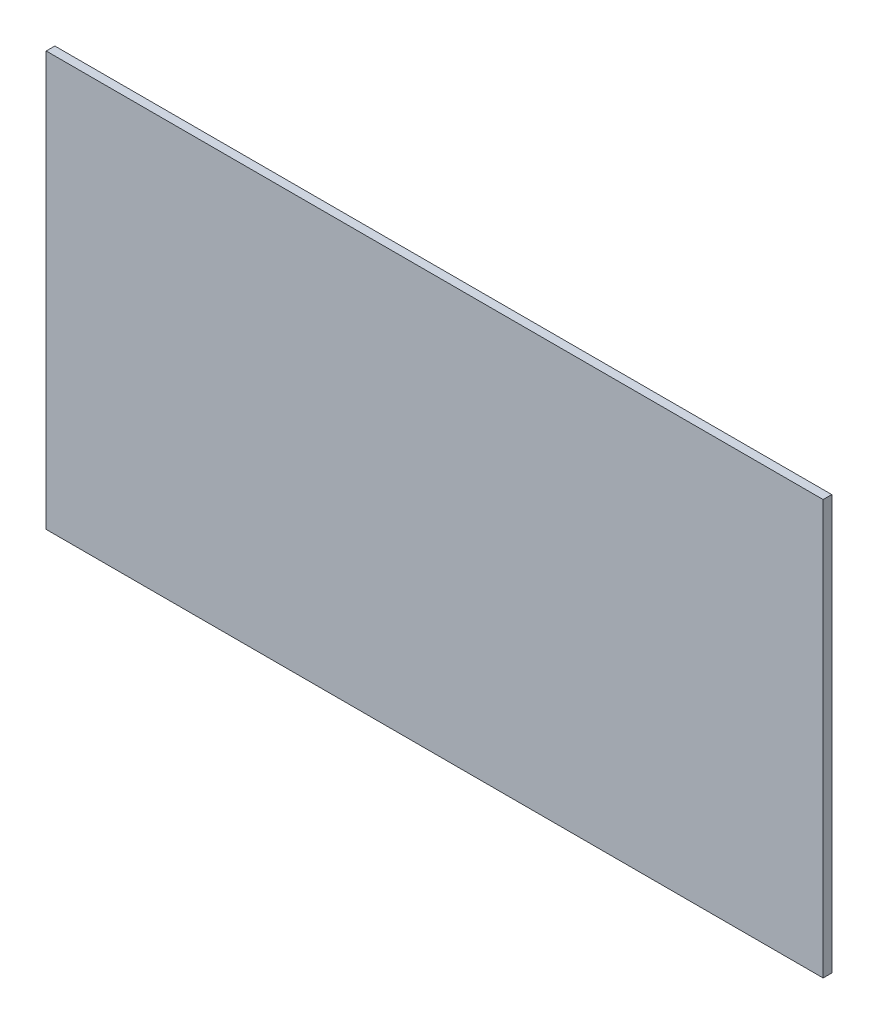
ISO-10303-21;
HEADER;
FILE_DESCRIPTION(('STEP AP214'),'2;1');
FILE_NAME('part.step','',(''),(''),'','','');
FILE_SCHEMA(('AUTOMOTIVE_DESIGN { 1 0 10303 214 1 1 1 1 }'));
ENDSEC;
DATA;
#1=APPLICATION_CONTEXT('core data for automotive mechanical design processes');
#2=APPLICATION_PROTOCOL_DEFINITION('international standard','automotive_design',2000,#1);
#3=PRODUCT_CONTEXT('',#1,'mechanical');
#4=PRODUCT('Part','Part','',(#3));
#5=PRODUCT_RELATED_PRODUCT_CATEGORY('part','',(#4));
#6=PRODUCT_DEFINITION_FORMATION('','',#4);
#7=PRODUCT_DEFINITION_CONTEXT('part definition',#1,'design');
#8=PRODUCT_DEFINITION('design','',#6,#7);
#9=PRODUCT_DEFINITION_SHAPE('','',#8);
#10=(LENGTH_UNIT() NAMED_UNIT(*) SI_UNIT(.MILLI.,.METRE.));
#11=(NAMED_UNIT(*) PLANE_ANGLE_UNIT() SI_UNIT($,.RADIAN.));
#12=(NAMED_UNIT(*) SI_UNIT($,.STERADIAN.) SOLID_ANGLE_UNIT());
#13=UNCERTAINTY_MEASURE_WITH_UNIT(LENGTH_MEASURE(1.E-05),#10,'distance_accuracy_value','');
#14=(GEOMETRIC_REPRESENTATION_CONTEXT(3) GLOBAL_UNCERTAINTY_ASSIGNED_CONTEXT((#13)) GLOBAL_UNIT_ASSIGNED_CONTEXT((#10,
#11,#12)) REPRESENTATION_CONTEXT('',''));
#15=CARTESIAN_POINT('',(0.,0.,0.));
#16=DIRECTION('',(0.,0.,1.));
#17=DIRECTION('',(1.,0.,0.));
#18=AXIS2_PLACEMENT_3D('',#15,#16,#17);
#19=CARTESIAN_POINT('',(-571.5,-723.9,12.7));
#20=DIRECTION('',(1.,0.,0.));
#21=DIRECTION('',(0.,1.,0.));
#22=AXIS2_PLACEMENT_3D('',#19,#20,#21);
#23=PLANE('',#22);
#24=DIRECTION('',(0.,-1.,0.));
#25=VECTOR('',#24,1.);
#26=CARTESIAN_POINT('',(-571.5,-723.9,0.));
#27=LINE('',#26,#25);
#28=CARTESIAN_POINT('',(-571.5,-114.3,0.));
#29=VERTEX_POINT('',#28);
#30=CARTESIAN_POINT('',(-571.5,-723.9,0.));
#31=VERTEX_POINT('',#30);
#32=EDGE_CURVE('E96',#29,#31,#27,.T.);
#33=ORIENTED_EDGE('',*,*,#32,.T.);
#34=DIRECTION('',(0.,0.,-1.));
#35=VECTOR('',#34,1.);
#36=CARTESIAN_POINT('',(-571.5,-723.9,12.7));
#37=LINE('',#36,#35);
#38=CARTESIAN_POINT('',(-571.5,-723.9,12.7));
#39=VERTEX_POINT('',#38);
#40=EDGE_CURVE('E11',#39,#31,#37,.T.);
#41=ORIENTED_EDGE('',*,*,#40,.F.);
#42=DIRECTION('',(0.,-1.,0.));
#43=VECTOR('',#42,1.);
#44=CARTESIAN_POINT('',(-571.5,-723.9,12.7));
#45=LINE('',#44,#43);
#46=CARTESIAN_POINT('',(-571.5,-114.3,12.7));
#47=VERTEX_POINT('',#46);
#48=EDGE_CURVE('E84',#47,#39,#45,.T.);
#49=ORIENTED_EDGE('',*,*,#48,.F.);
#50=DIRECTION('',(0.,0.,-1.));
#51=VECTOR('',#50,1.);
#52=CARTESIAN_POINT('',(-571.5,-114.3,12.7));
#53=LINE('',#52,#51);
#54=EDGE_CURVE('E92',#47,#29,#53,.T.);
#55=ORIENTED_EDGE('',*,*,#54,.T.);
#56=EDGE_LOOP('',(#33,#41,#49,#55));
#57=FACE_BOUND('',#56,.T.);
#58=ADVANCED_FACE('F33',(#57),#23,.F.);
#59=CARTESIAN_POINT('',(-571.5,-723.9,12.7));
#60=DIRECTION('',(0.,1.,0.));
#61=DIRECTION('',(-1.,0.,0.));
#62=AXIS2_PLACEMENT_3D('',#59,#60,#61);
#63=PLANE('',#62);
#64=DIRECTION('',(1.,0.,0.));
#65=VECTOR('',#64,1.);
#66=CARTESIAN_POINT('',(-571.5,-723.9,0.));
#67=LINE('',#66,#65);
#68=CARTESIAN_POINT('',(571.5,-723.9,0.));
#69=VERTEX_POINT('',#68);
#70=EDGE_CURVE('E88',#31,#69,#67,.T.);
#71=ORIENTED_EDGE('',*,*,#70,.T.);
#72=DIRECTION('',(0.,0.,-1.));
#73=VECTOR('',#72,1.);
#74=CARTESIAN_POINT('',(571.5,-723.9,12.7));
#75=LINE('',#74,#73);
#76=CARTESIAN_POINT('',(571.5,-723.9,12.7));
#77=VERTEX_POINT('',#76);
#78=EDGE_CURVE('E41',#77,#69,#75,.T.);
#79=ORIENTED_EDGE('',*,*,#78,.F.);
#80=DIRECTION('',(1.,0.,0.));
#81=VECTOR('',#80,1.);
#82=CARTESIAN_POINT('',(-571.5,-723.9,12.7));
#83=LINE('',#82,#81);
#84=EDGE_CURVE('E79',#39,#77,#83,.T.);
#85=ORIENTED_EDGE('',*,*,#84,.F.);
#86=ORIENTED_EDGE('',*,*,#40,.T.);
#87=EDGE_LOOP('',(#71,#79,#85,#86));
#88=FACE_BOUND('',#87,.T.);
#89=ADVANCED_FACE('F87',(#88),#63,.F.);
#90=CARTESIAN_POINT('',(571.5,-723.9,12.7));
#91=DIRECTION('',(-1.,0.,0.));
#92=DIRECTION('',(0.,0.,1.));
#93=AXIS2_PLACEMENT_3D('',#90,#91,#92);
#94=PLANE('',#93);
#95=DIRECTION('',(0.,1.,0.));
#96=VECTOR('',#95,1.);
#97=CARTESIAN_POINT('',(571.5,-723.9,0.));
#98=LINE('',#97,#96);
#99=CARTESIAN_POINT('',(571.5,-114.3,0.));
#100=VERTEX_POINT('',#99);
#101=EDGE_CURVE('E66',#69,#100,#98,.T.);
#102=ORIENTED_EDGE('',*,*,#101,.T.);
#103=DIRECTION('',(0.,0.,-1.));
#104=VECTOR('',#103,1.);
#105=CARTESIAN_POINT('',(571.5,-114.3,12.7));
#106=LINE('',#105,#104);
#107=CARTESIAN_POINT('',(571.5,-114.3,12.7));
#108=VERTEX_POINT('',#107);
#109=EDGE_CURVE('E89',#108,#100,#106,.T.);
#110=ORIENTED_EDGE('',*,*,#109,.F.);
#111=DIRECTION('',(0.,1.,0.));
#112=VECTOR('',#111,1.);
#113=CARTESIAN_POINT('',(571.5,-723.9,12.7));
#114=LINE('',#113,#112);
#115=EDGE_CURVE('E82',#77,#108,#114,.T.);
#116=ORIENTED_EDGE('',*,*,#115,.F.);
#117=ORIENTED_EDGE('',*,*,#78,.T.);
#118=EDGE_LOOP('',(#102,#110,#116,#117));
#119=FACE_BOUND('',#118,.T.);
#120=ADVANCED_FACE('F90',(#119),#94,.F.);
#121=CARTESIAN_POINT('',(-571.5,-114.3,12.7));
#122=DIRECTION('',(0.,-1.,0.));
#123=DIRECTION('',(1.,0.,0.));
#124=AXIS2_PLACEMENT_3D('',#121,#122,#123);
#125=PLANE('',#124);
#126=DIRECTION('',(-1.,0.,0.));
#127=VECTOR('',#126,1.);
#128=CARTESIAN_POINT('',(-571.5,-114.3,0.));
#129=LINE('',#128,#127);
#130=EDGE_CURVE('E72',#100,#29,#129,.T.);
#131=ORIENTED_EDGE('',*,*,#130,.T.);
#132=ORIENTED_EDGE('',*,*,#54,.F.);
#133=DIRECTION('',(-1.,0.,0.));
#134=VECTOR('',#133,1.);
#135=CARTESIAN_POINT('',(-571.5,-114.3,12.7));
#136=LINE('',#135,#134);
#137=EDGE_CURVE('E49',#108,#47,#136,.T.);
#138=ORIENTED_EDGE('',*,*,#137,.F.);
#139=ORIENTED_EDGE('',*,*,#109,.T.);
#140=EDGE_LOOP('',(#131,#132,#138,#139));
#141=FACE_BOUND('',#140,.T.);
#142=ADVANCED_FACE('F103',(#141),#125,.F.);
#143=CARTESIAN_POINT('',(0.,0.,12.7));
#144=DIRECTION('',(0.,0.,-1.));
#145=DIRECTION('',(-1.,0.,0.));
#146=AXIS2_PLACEMENT_3D('',#143,#144,#145);
#147=PLANE('',#146);
#148=ORIENTED_EDGE('',*,*,#48,.T.);
#149=ORIENTED_EDGE('',*,*,#84,.T.);
#150=ORIENTED_EDGE('',*,*,#115,.T.);
#151=ORIENTED_EDGE('',*,*,#137,.T.);
#152=EDGE_LOOP('',(#148,#149,#150,#151));
#153=FACE_BOUND('',#152,.T.);
#154=ADVANCED_FACE('F80',(#153),#147,.F.);
#155=CARTESIAN_POINT('',(0.,0.,0.));
#156=DIRECTION('',(0.,0.,-1.));
#157=DIRECTION('',(-1.,0.,0.));
#158=AXIS2_PLACEMENT_3D('',#155,#156,#157);
#159=PLANE('',#158);
#160=ORIENTED_EDGE('',*,*,#32,.F.);
#161=ORIENTED_EDGE('',*,*,#130,.F.);
#162=ORIENTED_EDGE('',*,*,#101,.F.);
#163=ORIENTED_EDGE('',*,*,#70,.F.);
#164=EDGE_LOOP('',(#160,#161,#162,#163));
#165=FACE_BOUND('',#164,.T.);
#166=ADVANCED_FACE('F106',(#165),#159,.T.);
#167=CLOSED_SHELL('',(#58,#89,#120,#142,#154,#166));
#168=MANIFOLD_SOLID_BREP('B2',#167);
#169=ADVANCED_BREP_SHAPE_REPRESENTATION('',(#18,#168),#14);
#170=SHAPE_DEFINITION_REPRESENTATION(#9,#169);
ENDSEC;
END-ISO-10303-21;
